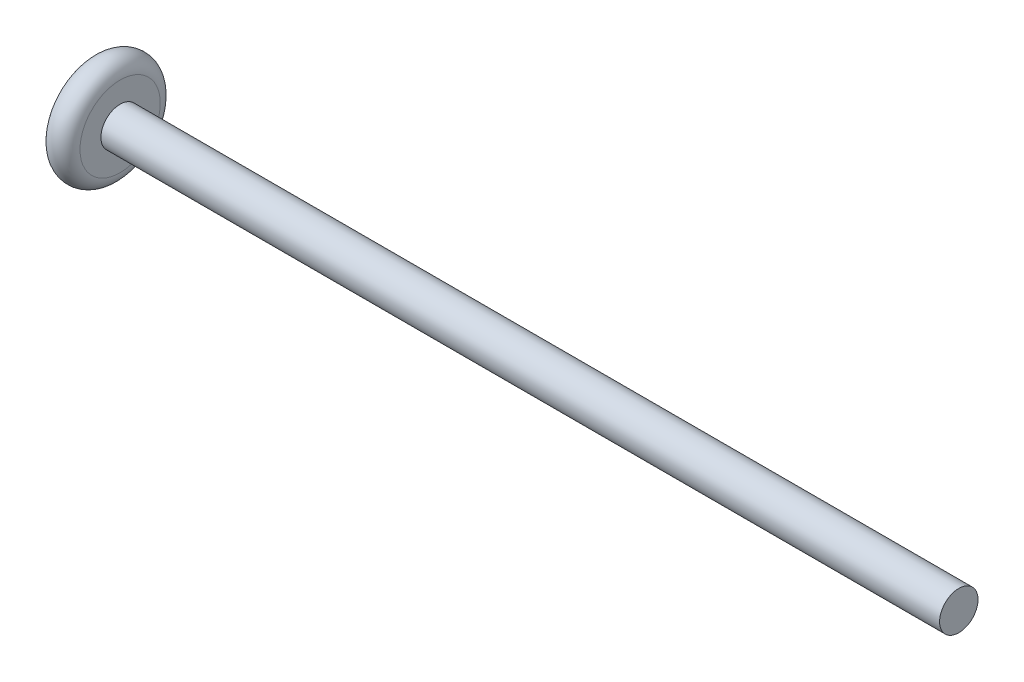
ISO-10303-21;
HEADER;
FILE_DESCRIPTION(('STEP AP214'),'2;1');
FILE_NAME('part.step','',(''),(''),'','','');
FILE_SCHEMA(('AUTOMOTIVE_DESIGN { 1 0 10303 214 1 1 1 1 }'));
ENDSEC;
DATA;
#1=APPLICATION_CONTEXT('core data for automotive mechanical design processes');
#2=APPLICATION_PROTOCOL_DEFINITION('international standard','automotive_design',2000,#1);
#3=PRODUCT_CONTEXT('',#1,'mechanical');
#4=PRODUCT('Part','Part','',(#3));
#5=PRODUCT_RELATED_PRODUCT_CATEGORY('part','',(#4));
#6=PRODUCT_DEFINITION_FORMATION('','',#4);
#7=PRODUCT_DEFINITION_CONTEXT('part definition',#1,'design');
#8=PRODUCT_DEFINITION('design','',#6,#7);
#9=PRODUCT_DEFINITION_SHAPE('','',#8);
#10=(LENGTH_UNIT() NAMED_UNIT(*) SI_UNIT(.MILLI.,.METRE.));
#11=(NAMED_UNIT(*) PLANE_ANGLE_UNIT() SI_UNIT($,.RADIAN.));
#12=(NAMED_UNIT(*) SI_UNIT($,.STERADIAN.) SOLID_ANGLE_UNIT());
#13=UNCERTAINTY_MEASURE_WITH_UNIT(LENGTH_MEASURE(1.E-05),#10,'distance_accuracy_value','');
#14=(GEOMETRIC_REPRESENTATION_CONTEXT(3) GLOBAL_UNCERTAINTY_ASSIGNED_CONTEXT((#13)) GLOBAL_UNIT_ASSIGNED_CONTEXT((#10,
#11,#12)) REPRESENTATION_CONTEXT('',''));
#15=CARTESIAN_POINT('',(0.,0.,0.));
#16=DIRECTION('',(0.,0.,1.));
#17=DIRECTION('',(1.,0.,0.));
#18=AXIS2_PLACEMENT_3D('',#15,#16,#17);
#19=CARTESIAN_POINT('',(0.,0.,0.));
#20=DIRECTION('',(1.,0.,0.));
#21=DIRECTION('',(0.,0.,-1.));
#22=AXIS2_PLACEMENT_3D('',#19,#20,#21);
#23=PLANE('',#22);
#24=CARTESIAN_POINT('',(0.,0.,0.));
#25=DIRECTION('',(-1.,0.,0.));
#26=DIRECTION('',(0.,0.,1.));
#27=AXIS2_PLACEMENT_3D('',#24,#25,#26);
#28=CIRCLE('',#27,4.7);
#29=CARTESIAN_POINT('',(0.,0.,4.7));
#30=VERTEX_POINT('',#29);
#31=EDGE_CURVE('E10',#30,#30,#28,.T.);
#32=ORIENTED_EDGE('',*,*,#31,.T.);
#33=EDGE_LOOP('',(#32));
#34=FACE_BOUND('',#33,.T.);
#35=ADVANCED_FACE('F32',(#34),#23,.F.);
#36=CARTESIAN_POINT('',(1.65,0.,0.));
#37=DIRECTION('',(-1.,0.,0.));
#38=DIRECTION('',(0.,0.,1.));
#39=AXIS2_PLACEMENT_3D('',#36,#37,#38);
#40=TOROIDAL_SURFACE('',#39,4.7,1.65);
#41=ORIENTED_EDGE('',*,*,#31,.F.);
#42=EDGE_LOOP('',(#41));
#43=FACE_BOUND('',#42,.T.);
#44=CARTESIAN_POINT('',(3.3,0.,0.));
#45=DIRECTION('',(-1.,0.,0.));
#46=DIRECTION('',(0.,0.,1.));
#47=AXIS2_PLACEMENT_3D('',#44,#45,#46);
#48=CIRCLE('',#47,4.7);
#49=CARTESIAN_POINT('',(3.3,0.,4.7));
#50=VERTEX_POINT('',#49);
#51=EDGE_CURVE('E38',#50,#50,#48,.T.);
#52=ORIENTED_EDGE('',*,*,#51,.T.);
#53=EDGE_LOOP('',(#52));
#54=FACE_BOUND('',#53,.T.);
#55=ADVANCED_FACE('F64',(#43,#54),#40,.T.);
#56=CARTESIAN_POINT('',(3.3,4.7,0.));
#57=DIRECTION('',(-1.,0.,0.));
#58=DIRECTION('',(0.,0.,1.));
#59=AXIS2_PLACEMENT_3D('',#56,#57,#58);
#60=PLANE('',#59);
#61=ORIENTED_EDGE('',*,*,#51,.F.);
#62=EDGE_LOOP('',(#61));
#63=FACE_BOUND('',#62,.T.);
#64=CARTESIAN_POINT('',(3.3,0.,0.));
#65=DIRECTION('',(-1.,0.,0.));
#66=DIRECTION('',(0.,0.,1.));
#67=AXIS2_PLACEMENT_3D('',#64,#65,#66);
#68=CIRCLE('',#67,2.25);
#69=CARTESIAN_POINT('',(3.3,0.,2.25));
#70=VERTEX_POINT('',#69);
#71=EDGE_CURVE('E42',#70,#70,#68,.T.);
#72=ORIENTED_EDGE('',*,*,#71,.T.);
#73=EDGE_LOOP('',(#72));
#74=FACE_BOUND('',#73,.T.);
#75=ADVANCED_FACE('F60',(#63,#74),#60,.F.);
#76=CARTESIAN_POINT('',(0.,0.,0.));
#77=DIRECTION('',(-1.,0.,0.));
#78=DIRECTION('',(0.,0.,1.));
#79=AXIS2_PLACEMENT_3D('',#76,#77,#78);
#80=CYLINDRICAL_SURFACE('',#79,2.25);
#81=ORIENTED_EDGE('',*,*,#71,.F.);
#82=EDGE_LOOP('',(#81));
#83=FACE_BOUND('',#82,.T.);
#84=CARTESIAN_POINT('',(101.5,0.,0.));
#85=DIRECTION('',(-1.,0.,0.));
#86=DIRECTION('',(0.,0.,1.));
#87=AXIS2_PLACEMENT_3D('',#84,#85,#86);
#88=CIRCLE('',#87,2.25);
#89=CARTESIAN_POINT('',(101.5,0.,2.25));
#90=VERTEX_POINT('',#89);
#91=EDGE_CURVE('E46',#90,#90,#88,.T.);
#92=ORIENTED_EDGE('',*,*,#91,.T.);
#93=EDGE_LOOP('',(#92));
#94=FACE_BOUND('',#93,.T.);
#95=ADVANCED_FACE('F52',(#83,#94),#80,.T.);
#96=CARTESIAN_POINT('',(101.5,2.25,0.));
#97=DIRECTION('',(-1.,0.,0.));
#98=DIRECTION('',(0.,0.,1.));
#99=AXIS2_PLACEMENT_3D('',#96,#97,#98);
#100=PLANE('',#99);
#101=ORIENTED_EDGE('',*,*,#91,.F.);
#102=EDGE_LOOP('',(#101));
#103=FACE_BOUND('',#102,.T.);
#104=ADVANCED_FACE('F54',(#103),#100,.F.);
#105=CLOSED_SHELL('',(#35,#55,#75,#95,#104));
#106=MANIFOLD_SOLID_BREP('B2',#105);
#107=ADVANCED_BREP_SHAPE_REPRESENTATION('',(#18,#106),#14);
#108=SHAPE_DEFINITION_REPRESENTATION(#9,#107);
ENDSEC;
END-ISO-10303-21;
